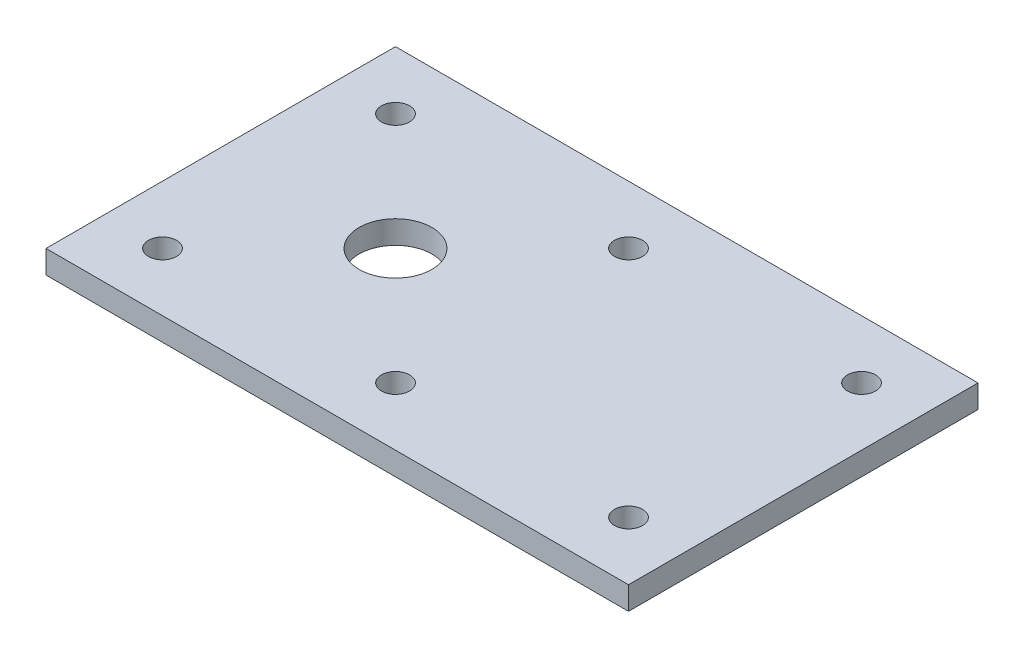
ISO-10303-21;
HEADER;
FILE_DESCRIPTION(('STEP AP214'),'2;1');
FILE_NAME('part.step','',(''),(''),'','','');
FILE_SCHEMA(('AUTOMOTIVE_DESIGN { 1 0 10303 214 1 1 1 1 }'));
ENDSEC;
DATA;
#1=APPLICATION_CONTEXT('core data for automotive mechanical design processes');
#2=APPLICATION_PROTOCOL_DEFINITION('international standard','automotive_design',2000,#1);
#3=PRODUCT_CONTEXT('',#1,'mechanical');
#4=PRODUCT('Part','Part','',(#3));
#5=PRODUCT_RELATED_PRODUCT_CATEGORY('part','',(#4));
#6=PRODUCT_DEFINITION_FORMATION('','',#4);
#7=PRODUCT_DEFINITION_CONTEXT('part definition',#1,'design');
#8=PRODUCT_DEFINITION('design','',#6,#7);
#9=PRODUCT_DEFINITION_SHAPE('','',#8);
#10=(LENGTH_UNIT() NAMED_UNIT(*) SI_UNIT(.MILLI.,.METRE.));
#11=(NAMED_UNIT(*) PLANE_ANGLE_UNIT() SI_UNIT($,.RADIAN.));
#12=(NAMED_UNIT(*) SI_UNIT($,.STERADIAN.) SOLID_ANGLE_UNIT());
#13=UNCERTAINTY_MEASURE_WITH_UNIT(LENGTH_MEASURE(1.E-05),#10,'distance_accuracy_value','');
#14=(GEOMETRIC_REPRESENTATION_CONTEXT(3) GLOBAL_UNCERTAINTY_ASSIGNED_CONTEXT((#13)) GLOBAL_UNIT_ASSIGNED_CONTEXT((#10,
#11,#12)) REPRESENTATION_CONTEXT('',''));
#15=CARTESIAN_POINT('',(0.,0.,0.));
#16=DIRECTION('',(0.,0.,1.));
#17=DIRECTION('',(1.,0.,0.));
#18=AXIS2_PLACEMENT_3D('',#15,#16,#17);
#19=CARTESIAN_POINT('',(120.,0.,40.));
#20=DIRECTION('',(0.,1.,0.));
#21=DIRECTION('',(0.,0.,1.));
#22=AXIS2_PLACEMENT_3D('',#19,#20,#21);
#23=CYLINDRICAL_SURFACE('',#22,4.82599999999999);
#24=CARTESIAN_POINT('',(120.,0.,40.));
#25=DIRECTION('',(0.,1.,0.));
#26=DIRECTION('',(0.,0.,1.));
#27=AXIS2_PLACEMENT_3D('',#24,#25,#26);
#28=CIRCLE('',#27,4.82599999999999);
#29=CARTESIAN_POINT('',(120.,0.,44.826));
#30=VERTEX_POINT('',#29);
#31=EDGE_CURVE('E40',#30,#30,#28,.T.);
#32=ORIENTED_EDGE('',*,*,#31,.F.);
#33=EDGE_LOOP('',(#32));
#34=FACE_BOUND('',#33,.T.);
#35=CARTESIAN_POINT('',(120.,7.9248,40.));
#36=DIRECTION('',(0.,1.,0.));
#37=DIRECTION('',(0.,0.,1.));
#38=AXIS2_PLACEMENT_3D('',#35,#36,#37);
#39=CIRCLE('',#38,4.82599999999999);
#40=CARTESIAN_POINT('',(120.,7.9248,44.826));
#41=VERTEX_POINT('',#40);
#42=EDGE_CURVE('E11',#41,#41,#39,.T.);
#43=ORIENTED_EDGE('',*,*,#42,.T.);
#44=EDGE_LOOP('',(#43));
#45=FACE_BOUND('',#44,.T.);
#46=ADVANCED_FACE('F32',(#34,#45),#23,.F.);
#47=CARTESIAN_POINT('',(40.,0.,40.));
#48=DIRECTION('',(0.,1.,0.));
#49=DIRECTION('',(0.,0.,1.));
#50=AXIS2_PLACEMENT_3D('',#47,#48,#49);
#51=CYLINDRICAL_SURFACE('',#50,4.82599999999999);
#52=CARTESIAN_POINT('',(40.,0.,40.));
#53=DIRECTION('',(0.,1.,0.));
#54=DIRECTION('',(0.,0.,1.));
#55=AXIS2_PLACEMENT_3D('',#52,#53,#54);
#56=CIRCLE('',#55,4.82599999999999);
#57=CARTESIAN_POINT('',(40.,0.,44.826));
#58=VERTEX_POINT('',#57);
#59=EDGE_CURVE('E122',#58,#58,#56,.T.);
#60=ORIENTED_EDGE('',*,*,#59,.F.);
#61=EDGE_LOOP('',(#60));
#62=FACE_BOUND('',#61,.T.);
#63=CARTESIAN_POINT('',(40.,7.9248,40.));
#64=DIRECTION('',(0.,1.,0.));
#65=DIRECTION('',(0.,0.,1.));
#66=AXIS2_PLACEMENT_3D('',#63,#64,#65);
#67=CIRCLE('',#66,4.82599999999999);
#68=CARTESIAN_POINT('',(40.,7.9248,44.826));
#69=VERTEX_POINT('',#68);
#70=EDGE_CURVE('E125',#69,#69,#67,.T.);
#71=ORIENTED_EDGE('',*,*,#70,.T.);
#72=EDGE_LOOP('',(#71));
#73=FACE_BOUND('',#72,.T.);
#74=ADVANCED_FACE('F134',(#62,#73),#51,.F.);
#75=CARTESIAN_POINT('',(-40.,0.,40.));
#76=DIRECTION('',(0.,1.,0.));
#77=DIRECTION('',(0.,0.,1.));
#78=AXIS2_PLACEMENT_3D('',#75,#76,#77);
#79=CYLINDRICAL_SURFACE('',#78,4.82599999999999);
#80=CARTESIAN_POINT('',(-40.,0.,40.));
#81=DIRECTION('',(0.,1.,0.));
#82=DIRECTION('',(0.,0.,1.));
#83=AXIS2_PLACEMENT_3D('',#80,#81,#82);
#84=CIRCLE('',#83,4.82599999999999);
#85=CARTESIAN_POINT('',(-40.,0.,44.826));
#86=VERTEX_POINT('',#85);
#87=EDGE_CURVE('E116',#86,#86,#84,.T.);
#88=ORIENTED_EDGE('',*,*,#87,.F.);
#89=EDGE_LOOP('',(#88));
#90=FACE_BOUND('',#89,.T.);
#91=CARTESIAN_POINT('',(-40.,7.9248,40.));
#92=DIRECTION('',(0.,1.,0.));
#93=DIRECTION('',(0.,0.,1.));
#94=AXIS2_PLACEMENT_3D('',#91,#92,#93);
#95=CIRCLE('',#94,4.82599999999999);
#96=CARTESIAN_POINT('',(-40.,7.9248,44.826));
#97=VERTEX_POINT('',#96);
#98=EDGE_CURVE('E119',#97,#97,#95,.T.);
#99=ORIENTED_EDGE('',*,*,#98,.T.);
#100=EDGE_LOOP('',(#99));
#101=FACE_BOUND('',#100,.T.);
#102=ADVANCED_FACE('F165',(#90,#101),#79,.F.);
#103=CARTESIAN_POINT('',(120.,0.,-40.));
#104=DIRECTION('',(0.,1.,0.));
#105=DIRECTION('',(0.,0.,1.));
#106=AXIS2_PLACEMENT_3D('',#103,#104,#105);
#107=CYLINDRICAL_SURFACE('',#106,4.82599999999999);
#108=CARTESIAN_POINT('',(120.,0.,-40.));
#109=DIRECTION('',(0.,1.,0.));
#110=DIRECTION('',(0.,0.,1.));
#111=AXIS2_PLACEMENT_3D('',#108,#109,#110);
#112=CIRCLE('',#111,4.82599999999999);
#113=CARTESIAN_POINT('',(120.,0.,-35.174));
#114=VERTEX_POINT('',#113);
#115=EDGE_CURVE('E110',#114,#114,#112,.T.);
#116=ORIENTED_EDGE('',*,*,#115,.F.);
#117=EDGE_LOOP('',(#116));
#118=FACE_BOUND('',#117,.T.);
#119=CARTESIAN_POINT('',(120.,7.9248,-40.));
#120=DIRECTION('',(0.,1.,0.));
#121=DIRECTION('',(0.,0.,1.));
#122=AXIS2_PLACEMENT_3D('',#119,#120,#121);
#123=CIRCLE('',#122,4.82599999999999);
#124=CARTESIAN_POINT('',(120.,7.9248,-35.174));
#125=VERTEX_POINT('',#124);
#126=EDGE_CURVE('E113',#125,#125,#123,.T.);
#127=ORIENTED_EDGE('',*,*,#126,.T.);
#128=EDGE_LOOP('',(#127));
#129=FACE_BOUND('',#128,.T.);
#130=ADVANCED_FACE('F161',(#118,#129),#107,.F.);
#131=CARTESIAN_POINT('',(-60.,7.9248,60.));
#132=DIRECTION('',(0.,0.,-1.));
#133=DIRECTION('',(-1.,0.,0.));
#134=AXIS2_PLACEMENT_3D('',#131,#132,#133);
#135=PLANE('',#134);
#136=DIRECTION('',(1.,0.,0.));
#137=VECTOR('',#136,1.);
#138=CARTESIAN_POINT('',(-60.,0.,60.));
#139=LINE('',#138,#137);
#140=CARTESIAN_POINT('',(-60.,0.,60.));
#141=VERTEX_POINT('',#140);
#142=CARTESIAN_POINT('',(140.,0.,60.));
#143=VERTEX_POINT('',#142);
#144=EDGE_CURVE('E99',#141,#143,#139,.T.);
#145=ORIENTED_EDGE('',*,*,#144,.T.);
#146=DIRECTION('',(0.,-1.,0.));
#147=VECTOR('',#146,1.);
#148=CARTESIAN_POINT('',(140.,7.9248,60.));
#149=LINE('',#148,#147);
#150=CARTESIAN_POINT('',(140.,7.9248,60.));
#151=VERTEX_POINT('',#150);
#152=EDGE_CURVE('E87',#151,#143,#149,.T.);
#153=ORIENTED_EDGE('',*,*,#152,.F.);
#154=DIRECTION('',(1.,0.,0.));
#155=VECTOR('',#154,1.);
#156=CARTESIAN_POINT('',(-60.,7.9248,60.));
#157=LINE('',#156,#155);
#158=CARTESIAN_POINT('',(-60.,7.9248,60.));
#159=VERTEX_POINT('',#158);
#160=EDGE_CURVE('E72',#159,#151,#157,.T.);
#161=ORIENTED_EDGE('',*,*,#160,.F.);
#162=DIRECTION('',(0.,-1.,0.));
#163=VECTOR('',#162,1.);
#164=CARTESIAN_POINT('',(-60.,7.9248,60.));
#165=LINE('',#164,#163);
#166=EDGE_CURVE('E95',#159,#141,#165,.T.);
#167=ORIENTED_EDGE('',*,*,#166,.T.);
#168=EDGE_LOOP('',(#145,#153,#161,#167));
#169=FACE_BOUND('',#168,.T.);
#170=ADVANCED_FACE('F158',(#169),#135,.F.);
#171=CARTESIAN_POINT('',(140.,7.9248,-60.));
#172=DIRECTION('',(1.,0.,0.));
#173=DIRECTION('',(0.,0.,-1.));
#174=AXIS2_PLACEMENT_3D('',#171,#172,#173);
#175=PLANE('',#174);
#176=DIRECTION('',(0.,0.,1.));
#177=VECTOR('',#176,1.);
#178=CARTESIAN_POINT('',(140.,0.,-60.));
#179=LINE('',#178,#177);
#180=CARTESIAN_POINT('',(140.,0.,-60.));
#181=VERTEX_POINT('',#180);
#182=EDGE_CURVE('E82',#181,#143,#179,.T.);
#183=ORIENTED_EDGE('',*,*,#182,.F.);
#184=DIRECTION('',(0.,-1.,0.));
#185=VECTOR('',#184,1.);
#186=CARTESIAN_POINT('',(140.,7.9248,-60.));
#187=LINE('',#186,#185);
#188=CARTESIAN_POINT('',(140.,7.9248,-60.));
#189=VERTEX_POINT('',#188);
#190=EDGE_CURVE('E78',#189,#181,#187,.T.);
#191=ORIENTED_EDGE('',*,*,#190,.F.);
#192=DIRECTION('',(0.,0.,1.));
#193=VECTOR('',#192,1.);
#194=CARTESIAN_POINT('',(140.,7.9248,-60.));
#195=LINE('',#194,#193);
#196=EDGE_CURVE('E80',#189,#151,#195,.T.);
#197=ORIENTED_EDGE('',*,*,#196,.T.);
#198=ORIENTED_EDGE('',*,*,#152,.T.);
#199=EDGE_LOOP('',(#183,#191,#197,#198));
#200=FACE_BOUND('',#199,.T.);
#201=ADVANCED_FACE('F79',(#200),#175,.T.);
#202=CARTESIAN_POINT('',(-60.,7.9248,-60.));
#203=DIRECTION('',(0.,0.,-1.));
#204=DIRECTION('',(-1.,0.,0.));
#205=AXIS2_PLACEMENT_3D('',#202,#203,#204);
#206=PLANE('',#205);
#207=DIRECTION('',(1.,0.,0.));
#208=VECTOR('',#207,1.);
#209=CARTESIAN_POINT('',(-60.,0.,-60.));
#210=LINE('',#209,#208);
#211=CARTESIAN_POINT('',(-60.,0.,-60.));
#212=VERTEX_POINT('',#211);
#213=EDGE_CURVE('E104',#212,#181,#210,.T.);
#214=ORIENTED_EDGE('',*,*,#213,.F.);
#215=DIRECTION('',(0.,-1.,0.));
#216=VECTOR('',#215,1.);
#217=CARTESIAN_POINT('',(-60.,7.9248,-60.));
#218=LINE('',#217,#216);
#219=CARTESIAN_POINT('',(-60.,7.9248,-60.));
#220=VERTEX_POINT('',#219);
#221=EDGE_CURVE('E64',#220,#212,#218,.T.);
#222=ORIENTED_EDGE('',*,*,#221,.F.);
#223=DIRECTION('',(1.,0.,0.));
#224=VECTOR('',#223,1.);
#225=CARTESIAN_POINT('',(-60.,7.9248,-60.));
#226=LINE('',#225,#224);
#227=EDGE_CURVE('E91',#220,#189,#226,.T.);
#228=ORIENTED_EDGE('',*,*,#227,.T.);
#229=ORIENTED_EDGE('',*,*,#190,.T.);
#230=EDGE_LOOP('',(#214,#222,#228,#229));
#231=FACE_BOUND('',#230,.T.);
#232=ADVANCED_FACE('F93',(#231),#206,.T.);
#233=CARTESIAN_POINT('',(-60.,7.9248,-60.));
#234=DIRECTION('',(1.,0.,0.));
#235=DIRECTION('',(0.,0.,-1.));
#236=AXIS2_PLACEMENT_3D('',#233,#234,#235);
#237=PLANE('',#236);
#238=DIRECTION('',(0.,0.,1.));
#239=VECTOR('',#238,1.);
#240=CARTESIAN_POINT('',(-60.,0.,-60.));
#241=LINE('',#240,#239);
#242=EDGE_CURVE('E67',#212,#141,#241,.T.);
#243=ORIENTED_EDGE('',*,*,#242,.T.);
#244=ORIENTED_EDGE('',*,*,#166,.F.);
#245=DIRECTION('',(0.,0.,1.));
#246=VECTOR('',#245,1.);
#247=CARTESIAN_POINT('',(-60.,7.9248,-60.));
#248=LINE('',#247,#246);
#249=EDGE_CURVE('E48',#220,#159,#248,.T.);
#250=ORIENTED_EDGE('',*,*,#249,.F.);
#251=ORIENTED_EDGE('',*,*,#221,.T.);
#252=EDGE_LOOP('',(#243,#244,#250,#251));
#253=FACE_BOUND('',#252,.T.);
#254=ADVANCED_FACE('F138',(#253),#237,.F.);
#255=CARTESIAN_POINT('',(0.,7.9248,0.));
#256=DIRECTION('',(0.,-1.,0.));
#257=DIRECTION('',(0.,0.,-1.));
#258=AXIS2_PLACEMENT_3D('',#255,#256,#257);
#259=PLANE('',#258);
#260=CARTESIAN_POINT('',(0.,7.9248,0.));
#261=DIRECTION('',(0.,1.,0.));
#262=DIRECTION('',(0.,0.,1.));
#263=AXIS2_PLACEMENT_3D('',#260,#261,#262);
#264=CIRCLE('',#263,12.5);
#265=CARTESIAN_POINT('',(0.,7.9248,12.5));
#266=VERTEX_POINT('',#265);
#267=EDGE_CURVE('E260',#266,#266,#264,.T.);
#268=ORIENTED_EDGE('',*,*,#267,.F.);
#269=EDGE_LOOP('',(#268));
#270=FACE_BOUND('',#269,.T.);
#271=CARTESIAN_POINT('',(40.,7.9248,-40.));
#272=DIRECTION('',(0.,1.,0.));
#273=DIRECTION('',(0.,0.,1.));
#274=AXIS2_PLACEMENT_3D('',#271,#272,#273);
#275=CIRCLE('',#274,4.82599999999999);
#276=CARTESIAN_POINT('',(40.,7.9248,-35.174));
#277=VERTEX_POINT('',#276);
#278=EDGE_CURVE('E267',#277,#277,#275,.T.);
#279=ORIENTED_EDGE('',*,*,#278,.F.);
#280=EDGE_LOOP('',(#279));
#281=FACE_BOUND('',#280,.T.);
#282=CARTESIAN_POINT('',(-40.,7.9248,-40.));
#283=DIRECTION('',(0.,1.,0.));
#284=DIRECTION('',(0.,0.,1.));
#285=AXIS2_PLACEMENT_3D('',#282,#283,#284);
#286=CIRCLE('',#285,4.82599999999999);
#287=CARTESIAN_POINT('',(-40.,7.9248,-35.174));
#288=VERTEX_POINT('',#287);
#289=EDGE_CURVE('E270',#288,#288,#286,.T.);
#290=ORIENTED_EDGE('',*,*,#289,.F.);
#291=EDGE_LOOP('',(#290));
#292=FACE_BOUND('',#291,.T.);
#293=ORIENTED_EDGE('',*,*,#160,.T.);
#294=ORIENTED_EDGE('',*,*,#196,.F.);
#295=ORIENTED_EDGE('',*,*,#227,.F.);
#296=ORIENTED_EDGE('',*,*,#249,.T.);
#297=EDGE_LOOP('',(#293,#294,#295,#296));
#298=FACE_BOUND('',#297,.T.);
#299=ORIENTED_EDGE('',*,*,#126,.F.);
#300=EDGE_LOOP('',(#299));
#301=FACE_BOUND('',#300,.T.);
#302=ORIENTED_EDGE('',*,*,#98,.F.);
#303=EDGE_LOOP('',(#302));
#304=FACE_BOUND('',#303,.T.);
#305=ORIENTED_EDGE('',*,*,#70,.F.);
#306=EDGE_LOOP('',(#305));
#307=FACE_BOUND('',#306,.T.);
#308=ORIENTED_EDGE('',*,*,#42,.F.);
#309=EDGE_LOOP('',(#308));
#310=FACE_BOUND('',#309,.T.);
#311=ADVANCED_FACE('F89',(#270,#281,#292,#298,#301,#304,#307,#310),#259,.F.);
#312=CARTESIAN_POINT('',(0.,0.,0.));
#313=DIRECTION('',(0.,-1.,0.));
#314=DIRECTION('',(0.,0.,-1.));
#315=AXIS2_PLACEMENT_3D('',#312,#313,#314);
#316=PLANE('',#315);
#317=CARTESIAN_POINT('',(0.,0.,0.));
#318=DIRECTION('',(0.,1.,0.));
#319=DIRECTION('',(0.,0.,1.));
#320=AXIS2_PLACEMENT_3D('',#317,#318,#319);
#321=CIRCLE('',#320,12.5);
#322=CARTESIAN_POINT('',(0.,0.,12.5));
#323=VERTEX_POINT('',#322);
#324=EDGE_CURVE('E258',#323,#323,#321,.T.);
#325=ORIENTED_EDGE('',*,*,#324,.T.);
#326=EDGE_LOOP('',(#325));
#327=FACE_BOUND('',#326,.T.);
#328=CARTESIAN_POINT('',(40.,0.,-40.));
#329=DIRECTION('',(0.,1.,0.));
#330=DIRECTION('',(0.,0.,1.));
#331=AXIS2_PLACEMENT_3D('',#328,#329,#330);
#332=CIRCLE('',#331,4.82599999999999);
#333=CARTESIAN_POINT('',(40.,0.,-35.174));
#334=VERTEX_POINT('',#333);
#335=EDGE_CURVE('E262',#334,#334,#332,.T.);
#336=ORIENTED_EDGE('',*,*,#335,.T.);
#337=EDGE_LOOP('',(#336));
#338=FACE_BOUND('',#337,.T.);
#339=CARTESIAN_POINT('',(-40.,0.,-40.));
#340=DIRECTION('',(0.,1.,0.));
#341=DIRECTION('',(0.,0.,1.));
#342=AXIS2_PLACEMENT_3D('',#339,#340,#341);
#343=CIRCLE('',#342,4.82599999999999);
#344=CARTESIAN_POINT('',(-40.,0.,-35.174));
#345=VERTEX_POINT('',#344);
#346=EDGE_CURVE('E102',#345,#345,#343,.T.);
#347=ORIENTED_EDGE('',*,*,#346,.T.);
#348=EDGE_LOOP('',(#347));
#349=FACE_BOUND('',#348,.T.);
#350=ORIENTED_EDGE('',*,*,#144,.F.);
#351=ORIENTED_EDGE('',*,*,#242,.F.);
#352=ORIENTED_EDGE('',*,*,#213,.T.);
#353=ORIENTED_EDGE('',*,*,#182,.T.);
#354=EDGE_LOOP('',(#350,#351,#352,#353));
#355=FACE_BOUND('',#354,.T.);
#356=ORIENTED_EDGE('',*,*,#115,.T.);
#357=EDGE_LOOP('',(#356));
#358=FACE_BOUND('',#357,.T.);
#359=ORIENTED_EDGE('',*,*,#87,.T.);
#360=EDGE_LOOP('',(#359));
#361=FACE_BOUND('',#360,.T.);
#362=ORIENTED_EDGE('',*,*,#59,.T.);
#363=EDGE_LOOP('',(#362));
#364=FACE_BOUND('',#363,.T.);
#365=ORIENTED_EDGE('',*,*,#31,.T.);
#366=EDGE_LOOP('',(#365));
#367=FACE_BOUND('',#366,.T.);
#368=ADVANCED_FACE('F130',(#327,#338,#349,#355,#358,#361,#364,#367),#316,.T.);
#369=CARTESIAN_POINT('',(-40.,0.,-40.));
#370=DIRECTION('',(0.,1.,0.));
#371=DIRECTION('',(0.,0.,1.));
#372=AXIS2_PLACEMENT_3D('',#369,#370,#371);
#373=CYLINDRICAL_SURFACE('',#372,4.82599999999999);
#374=ORIENTED_EDGE('',*,*,#346,.F.);
#375=EDGE_LOOP('',(#374));
#376=FACE_BOUND('',#375,.T.);
#377=ORIENTED_EDGE('',*,*,#289,.T.);
#378=EDGE_LOOP('',(#377));
#379=FACE_BOUND('',#378,.T.);
#380=ADVANCED_FACE('F145',(#376,#379),#373,.F.);
#381=CARTESIAN_POINT('',(40.,0.,-40.));
#382=DIRECTION('',(0.,1.,0.));
#383=DIRECTION('',(0.,0.,1.));
#384=AXIS2_PLACEMENT_3D('',#381,#382,#383);
#385=CYLINDRICAL_SURFACE('',#384,4.82599999999999);
#386=ORIENTED_EDGE('',*,*,#335,.F.);
#387=EDGE_LOOP('',(#386));
#388=FACE_BOUND('',#387,.T.);
#389=ORIENTED_EDGE('',*,*,#278,.T.);
#390=EDGE_LOOP('',(#389));
#391=FACE_BOUND('',#390,.T.);
#392=ADVANCED_FACE('F214',(#388,#391),#385,.F.);
#393=CARTESIAN_POINT('',(0.,0.,0.));
#394=DIRECTION('',(0.,1.,0.));
#395=DIRECTION('',(0.,0.,1.));
#396=AXIS2_PLACEMENT_3D('',#393,#394,#395);
#397=CYLINDRICAL_SURFACE('',#396,12.5);
#398=ORIENTED_EDGE('',*,*,#324,.F.);
#399=EDGE_LOOP('',(#398));
#400=FACE_BOUND('',#399,.T.);
#401=ORIENTED_EDGE('',*,*,#267,.T.);
#402=EDGE_LOOP('',(#401));
#403=FACE_BOUND('',#402,.T.);
#404=ADVANCED_FACE('F235',(#400,#403),#397,.F.);
#405=CLOSED_SHELL('',(#46,#74,#102,#130,#170,#201,#232,#254,#311,#368,#380,#392,#404));
#406=MANIFOLD_SOLID_BREP('B2',#405);
#407=ADVANCED_BREP_SHAPE_REPRESENTATION('',(#18,#406),#14);
#408=SHAPE_DEFINITION_REPRESENTATION(#9,#407);
ENDSEC;
END-ISO-10303-21;
